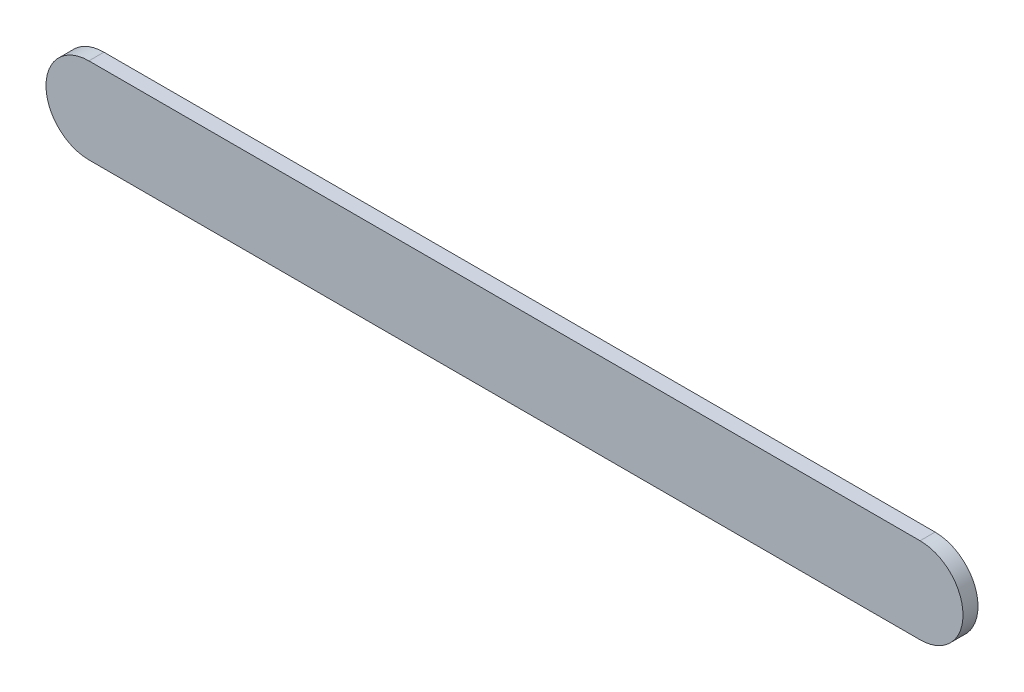
ISO-10303-21;
HEADER;
FILE_DESCRIPTION(('STEP AP214'),'2;1');
FILE_NAME('part.step','',(''),(''),'','','');
FILE_SCHEMA(('AUTOMOTIVE_DESIGN { 1 0 10303 214 1 1 1 1 }'));
ENDSEC;
DATA;
#1=APPLICATION_CONTEXT('core data for automotive mechanical design processes');
#2=APPLICATION_PROTOCOL_DEFINITION('international standard','automotive_design',2000,#1);
#3=PRODUCT_CONTEXT('',#1,'mechanical');
#4=PRODUCT('Part','Part','',(#3));
#5=PRODUCT_RELATED_PRODUCT_CATEGORY('part','',(#4));
#6=PRODUCT_DEFINITION_FORMATION('','',#4);
#7=PRODUCT_DEFINITION_CONTEXT('part definition',#1,'design');
#8=PRODUCT_DEFINITION('design','',#6,#7);
#9=PRODUCT_DEFINITION_SHAPE('','',#8);
#10=(LENGTH_UNIT() NAMED_UNIT(*) SI_UNIT(.MILLI.,.METRE.));
#11=(NAMED_UNIT(*) PLANE_ANGLE_UNIT() SI_UNIT($,.RADIAN.));
#12=(NAMED_UNIT(*) SI_UNIT($,.STERADIAN.) SOLID_ANGLE_UNIT());
#13=UNCERTAINTY_MEASURE_WITH_UNIT(LENGTH_MEASURE(1.E-05),#10,'distance_accuracy_value','');
#14=(GEOMETRIC_REPRESENTATION_CONTEXT(3) GLOBAL_UNCERTAINTY_ASSIGNED_CONTEXT((#13)) GLOBAL_UNIT_ASSIGNED_CONTEXT((#10,
#11,#12)) REPRESENTATION_CONTEXT('',''));
#15=CARTESIAN_POINT('',(0.,0.,0.));
#16=DIRECTION('',(0.,0.,1.));
#17=DIRECTION('',(1.,0.,0.));
#18=AXIS2_PLACEMENT_3D('',#15,#16,#17);
#19=CARTESIAN_POINT('',(83.45,-111.5,1.635));
#20=DIRECTION('',(0.,0.,1.));
#21=DIRECTION('',(1.,0.,0.));
#22=AXIS2_PLACEMENT_3D('',#19,#20,#21);
#23=PLANE('',#22);
#24=DIRECTION('',(1.,0.,0.));
#25=VECTOR('',#24,1.);
#26=CARTESIAN_POINT('',(83.45,-111.5,1.635));
#27=LINE('',#26,#25);
#28=CARTESIAN_POINT('',(83.45,-111.5,1.635));
#29=VERTEX_POINT('',#28);
#30=CARTESIAN_POINT('',(85.3875,-111.5,1.635));
#31=VERTEX_POINT('',#30);
#32=EDGE_CURVE('E84',#29,#31,#27,.T.);
#33=ORIENTED_EDGE('',*,*,#32,.T.);
#34=CARTESIAN_POINT('',(85.3875,-111.4,1.635));
#35=DIRECTION('',(0.,0.,1.));
#36=DIRECTION('',(1.42108547152E-13,-1.,0.));
#37=AXIS2_PLACEMENT_3D('',#34,#35,#36);
#38=CIRCLE('',#37,0.1);
#39=CARTESIAN_POINT('',(85.3875,-111.3,1.635));
#40=VERTEX_POINT('',#39);
#41=EDGE_CURVE('E101',#31,#40,#38,.T.);
#42=ORIENTED_EDGE('',*,*,#41,.T.);
#43=DIRECTION('',(-1.,0.,0.));
#44=VECTOR('',#43,1.);
#45=CARTESIAN_POINT('',(85.3875,-111.3,1.635));
#46=LINE('',#45,#44);
#47=CARTESIAN_POINT('',(83.45,-111.3,1.635));
#48=VERTEX_POINT('',#47);
#49=EDGE_CURVE('E21',#40,#48,#46,.T.);
#50=ORIENTED_EDGE('',*,*,#49,.T.);
#51=CARTESIAN_POINT('',(83.45,-111.4,1.635));
#52=DIRECTION('',(0.,0.,1.));
#53=DIRECTION('',(0.,1.,0.));
#54=AXIS2_PLACEMENT_3D('',#51,#52,#53);
#55=CIRCLE('',#54,0.1);
#56=EDGE_CURVE('E11',#48,#29,#55,.T.);
#57=ORIENTED_EDGE('',*,*,#56,.T.);
#58=EDGE_LOOP('',(#33,#42,#50,#57));
#59=FACE_BOUND('',#58,.T.);
#60=ADVANCED_FACE('F17',(#59),#23,.T.);
#61=CARTESIAN_POINT('',(83.45,-111.5,1.6));
#62=DIRECTION('',(0.,0.,1.));
#63=DIRECTION('',(1.,0.,0.));
#64=AXIS2_PLACEMENT_3D('',#61,#62,#63);
#65=PLANE('',#64);
#66=CARTESIAN_POINT('',(83.45,-111.4,1.6));
#67=DIRECTION('',(0.,0.,1.));
#68=DIRECTION('',(0.,1.,0.));
#69=AXIS2_PLACEMENT_3D('',#66,#67,#68);
#70=CIRCLE('',#69,0.1);
#71=CARTESIAN_POINT('',(83.45,-111.3,1.6));
#72=VERTEX_POINT('',#71);
#73=CARTESIAN_POINT('',(83.45,-111.5,1.6));
#74=VERTEX_POINT('',#73);
#75=EDGE_CURVE('E27',#72,#74,#70,.T.);
#76=ORIENTED_EDGE('',*,*,#75,.F.);
#77=DIRECTION('',(-1.,0.,0.));
#78=VECTOR('',#77,1.);
#79=CARTESIAN_POINT('',(85.3875,-111.3,1.6));
#80=LINE('',#79,#78);
#81=CARTESIAN_POINT('',(85.3875,-111.3,1.6));
#82=VERTEX_POINT('',#81);
#83=EDGE_CURVE('E105',#82,#72,#80,.T.);
#84=ORIENTED_EDGE('',*,*,#83,.F.);
#85=CARTESIAN_POINT('',(85.3875,-111.4,1.6));
#86=DIRECTION('',(0.,0.,1.));
#87=DIRECTION('',(1.42108547152E-13,-1.,0.));
#88=AXIS2_PLACEMENT_3D('',#85,#86,#87);
#89=CIRCLE('',#88,0.1);
#90=CARTESIAN_POINT('',(85.3875,-111.5,1.6));
#91=VERTEX_POINT('',#90);
#92=EDGE_CURVE('E86',#91,#82,#89,.T.);
#93=ORIENTED_EDGE('',*,*,#92,.F.);
#94=DIRECTION('',(1.,0.,0.));
#95=VECTOR('',#94,1.);
#96=CARTESIAN_POINT('',(83.45,-111.5,1.6));
#97=LINE('',#96,#95);
#98=EDGE_CURVE('E82',#74,#91,#97,.T.);
#99=ORIENTED_EDGE('',*,*,#98,.F.);
#100=EDGE_LOOP('',(#76,#84,#93,#99));
#101=FACE_BOUND('',#100,.T.);
#102=ADVANCED_FACE('F19',(#101),#65,.F.);
#103=CARTESIAN_POINT('',(83.45,-111.4,1.6));
#104=DIRECTION('',(0.,0.,-1.));
#105=DIRECTION('',(0.,1.,0.));
#106=AXIS2_PLACEMENT_3D('',#103,#104,#105);
#107=CYLINDRICAL_SURFACE('',#106,0.1);
#108=ORIENTED_EDGE('',*,*,#75,.T.);
#109=DIRECTION('',(0.,0.,1.));
#110=VECTOR('',#109,1.);
#111=CARTESIAN_POINT('',(83.45,-111.5,1.6));
#112=LINE('',#111,#110);
#113=EDGE_CURVE('E71',#74,#29,#112,.T.);
#114=ORIENTED_EDGE('',*,*,#113,.T.);
#115=ORIENTED_EDGE('',*,*,#56,.F.);
#116=DIRECTION('',(0.,0.,1.));
#117=VECTOR('',#116,1.);
#118=CARTESIAN_POINT('',(83.45,-111.3,1.6));
#119=LINE('',#118,#117);
#120=EDGE_CURVE('E74',#72,#48,#119,.T.);
#121=ORIENTED_EDGE('',*,*,#120,.F.);
#122=EDGE_LOOP('',(#108,#114,#115,#121));
#123=FACE_BOUND('',#122,.T.);
#124=ADVANCED_FACE('F70',(#123),#107,.T.);
#125=CARTESIAN_POINT('',(85.3875,-111.3,1.6));
#126=DIRECTION('',(0.,-1.,0.));
#127=DIRECTION('',(0.,0.,-1.));
#128=AXIS2_PLACEMENT_3D('',#125,#126,#127);
#129=PLANE('',#128);
#130=ORIENTED_EDGE('',*,*,#83,.T.);
#131=ORIENTED_EDGE('',*,*,#120,.T.);
#132=ORIENTED_EDGE('',*,*,#49,.F.);
#133=DIRECTION('',(0.,0.,1.));
#134=VECTOR('',#133,1.);
#135=CARTESIAN_POINT('',(85.3875,-111.3,1.6));
#136=LINE('',#135,#134);
#137=EDGE_CURVE('E106',#82,#40,#136,.T.);
#138=ORIENTED_EDGE('',*,*,#137,.F.);
#139=EDGE_LOOP('',(#130,#131,#132,#138));
#140=FACE_BOUND('',#139,.T.);
#141=ADVANCED_FACE('F122',(#140),#129,.F.);
#142=CARTESIAN_POINT('',(85.3875,-111.4,1.6));
#143=DIRECTION('',(0.,0.,-1.));
#144=DIRECTION('',(1.42108547152E-13,-1.,0.));
#145=AXIS2_PLACEMENT_3D('',#142,#143,#144);
#146=CYLINDRICAL_SURFACE('',#145,0.1);
#147=ORIENTED_EDGE('',*,*,#92,.T.);
#148=ORIENTED_EDGE('',*,*,#137,.T.);
#149=ORIENTED_EDGE('',*,*,#41,.F.);
#150=DIRECTION('',(0.,0.,1.));
#151=VECTOR('',#150,1.);
#152=CARTESIAN_POINT('',(85.3875,-111.5,1.6));
#153=LINE('',#152,#151);
#154=EDGE_CURVE('E91',#91,#31,#153,.T.);
#155=ORIENTED_EDGE('',*,*,#154,.F.);
#156=EDGE_LOOP('',(#147,#148,#149,#155));
#157=FACE_BOUND('',#156,.T.);
#158=ADVANCED_FACE('F124',(#157),#146,.T.);
#159=CARTESIAN_POINT('',(83.45,-111.5,1.6));
#160=DIRECTION('',(0.,1.,0.));
#161=DIRECTION('',(1.,0.,0.));
#162=AXIS2_PLACEMENT_3D('',#159,#160,#161);
#163=PLANE('',#162);
#164=ORIENTED_EDGE('',*,*,#98,.T.);
#165=ORIENTED_EDGE('',*,*,#154,.T.);
#166=ORIENTED_EDGE('',*,*,#32,.F.);
#167=ORIENTED_EDGE('',*,*,#113,.F.);
#168=EDGE_LOOP('',(#164,#165,#166,#167));
#169=FACE_BOUND('',#168,.T.);
#170=ADVANCED_FACE('F80',(#169),#163,.F.);
#171=CLOSED_SHELL('',(#60,#102,#124,#141,#158,#170));
#172=MANIFOLD_SOLID_BREP('B1',#171);
#173=ADVANCED_BREP_SHAPE_REPRESENTATION('',(#18,#172),#14);
#174=SHAPE_DEFINITION_REPRESENTATION(#9,#173);
ENDSEC;
END-ISO-10303-21;
